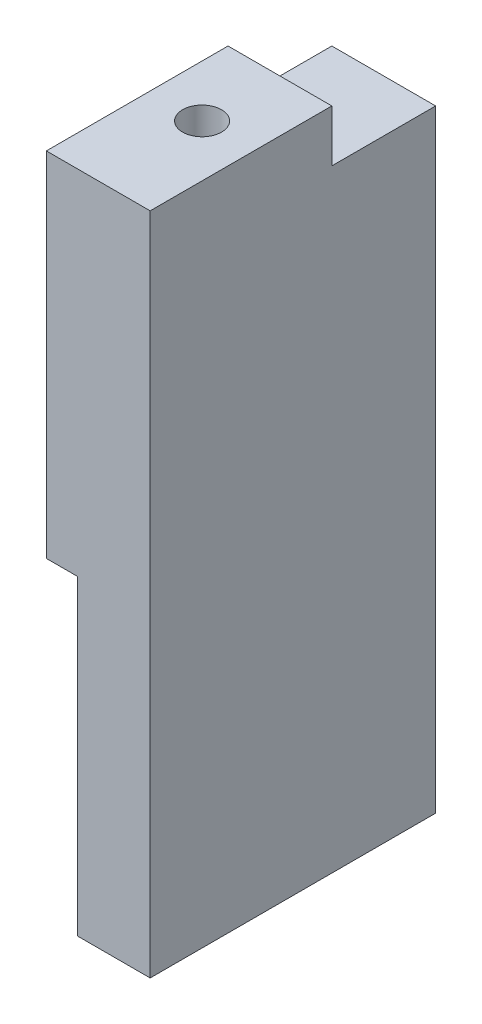
ISO-10303-21;
HEADER;
FILE_DESCRIPTION(('STEP AP214'),'2;1');
FILE_NAME('part.step','',(''),(''),'','','');
FILE_SCHEMA(('AUTOMOTIVE_DESIGN { 1 0 10303 214 1 1 1 1 }'));
ENDSEC;
DATA;
#1=APPLICATION_CONTEXT('core data for automotive mechanical design processes');
#2=APPLICATION_PROTOCOL_DEFINITION('international standard','automotive_design',2000,#1);
#3=PRODUCT_CONTEXT('',#1,'mechanical');
#4=PRODUCT('Part','Part','',(#3));
#5=PRODUCT_RELATED_PRODUCT_CATEGORY('part','',(#4));
#6=PRODUCT_DEFINITION_FORMATION('','',#4);
#7=PRODUCT_DEFINITION_CONTEXT('part definition',#1,'design');
#8=PRODUCT_DEFINITION('design','',#6,#7);
#9=PRODUCT_DEFINITION_SHAPE('','',#8);
#10=(LENGTH_UNIT() NAMED_UNIT(*) SI_UNIT(.MILLI.,.METRE.));
#11=(NAMED_UNIT(*) PLANE_ANGLE_UNIT() SI_UNIT($,.RADIAN.));
#12=(NAMED_UNIT(*) SI_UNIT($,.STERADIAN.) SOLID_ANGLE_UNIT());
#13=UNCERTAINTY_MEASURE_WITH_UNIT(LENGTH_MEASURE(1.E-05),#10,'distance_accuracy_value','');
#14=(GEOMETRIC_REPRESENTATION_CONTEXT(3) GLOBAL_UNCERTAINTY_ASSIGNED_CONTEXT((#13)) GLOBAL_UNIT_ASSIGNED_CONTEXT((#10,
#11,#12)) REPRESENTATION_CONTEXT('',''));
#15=CARTESIAN_POINT('',(0.,0.,0.));
#16=DIRECTION('',(0.,0.,1.));
#17=DIRECTION('',(1.,0.,0.));
#18=AXIS2_PLACEMENT_3D('',#15,#16,#17);
#19=CARTESIAN_POINT('',(0.,162.56,0.));
#20=DIRECTION('',(1.,0.,0.));
#21=DIRECTION('',(0.,0.,-1.));
#22=AXIS2_PLACEMENT_3D('',#19,#20,#21);
#23=PLANE('',#22);
#24=DIRECTION('',(0.,-1.,0.));
#25=VECTOR('',#24,1.);
#26=CARTESIAN_POINT('',(0.,162.56,-44.45));
#27=LINE('',#26,#25);
#28=CARTESIAN_POINT('',(0.,162.56,-44.45));
#29=VERTEX_POINT('',#28);
#30=CARTESIAN_POINT('',(0.,149.86,-44.45));
#31=VERTEX_POINT('',#30);
#32=EDGE_CURVE('E48',#29,#31,#27,.T.);
#33=ORIENTED_EDGE('',*,*,#32,.T.);
#34=DIRECTION('',(0.,0.,-1.));
#35=VECTOR('',#34,1.);
#36=CARTESIAN_POINT('',(0.,149.86,-69.85));
#37=LINE('',#36,#35);
#38=CARTESIAN_POINT('',(0.,149.86,-69.85));
#39=VERTEX_POINT('',#38);
#40=EDGE_CURVE('E125',#31,#39,#37,.T.);
#41=ORIENTED_EDGE('',*,*,#40,.T.);
#42=DIRECTION('',(0.,-1.,0.));
#43=VECTOR('',#42,1.);
#44=CARTESIAN_POINT('',(0.,162.56,-69.85));
#45=LINE('',#44,#43);
#46=CARTESIAN_POINT('',(0.,76.2,-69.85));
#47=VERTEX_POINT('',#46);
#48=EDGE_CURVE('E170',#39,#47,#45,.T.);
#49=ORIENTED_EDGE('',*,*,#48,.T.);
#50=DIRECTION('',(0.,0.,1.));
#51=VECTOR('',#50,1.);
#52=CARTESIAN_POINT('',(0.,76.2,-69.85));
#53=LINE('',#52,#51);
#54=CARTESIAN_POINT('',(0.,76.2,0.));
#55=VERTEX_POINT('',#54);
#56=EDGE_CURVE('E149',#47,#55,#53,.T.);
#57=ORIENTED_EDGE('',*,*,#56,.T.);
#58=DIRECTION('',(0.,-1.,0.));
#59=VECTOR('',#58,1.);
#60=CARTESIAN_POINT('',(0.,162.56,0.));
#61=LINE('',#60,#59);
#62=CARTESIAN_POINT('',(0.,162.56,0.));
#63=VERTEX_POINT('',#62);
#64=EDGE_CURVE('E11',#63,#55,#61,.T.);
#65=ORIENTED_EDGE('',*,*,#64,.F.);
#66=DIRECTION('',(0.,0.,1.));
#67=VECTOR('',#66,1.);
#68=CARTESIAN_POINT('',(0.,162.56,0.));
#69=LINE('',#68,#67);
#70=EDGE_CURVE('E162',#29,#63,#69,.T.);
#71=ORIENTED_EDGE('',*,*,#70,.F.);
#72=EDGE_LOOP('',(#33,#41,#49,#57,#65,#71));
#73=FACE_BOUND('',#72,.T.);
#74=ADVANCED_FACE('F34',(#73),#23,.F.);
#75=CARTESIAN_POINT('',(0.,162.56,0.));
#76=DIRECTION('',(0.,0.,-1.));
#77=DIRECTION('',(-1.,0.,0.));
#78=AXIS2_PLACEMENT_3D('',#75,#76,#77);
#79=PLANE('',#78);
#80=ORIENTED_EDGE('',*,*,#64,.T.);
#81=DIRECTION('',(-1.,0.,0.));
#82=VECTOR('',#81,1.);
#83=CARTESIAN_POINT('',(0.,76.2,0.));
#84=LINE('',#83,#82);
#85=CARTESIAN_POINT('',(7.61999999999999,76.2,0.));
#86=VERTEX_POINT('',#85);
#87=EDGE_CURVE('E142',#86,#55,#84,.T.);
#88=ORIENTED_EDGE('',*,*,#87,.F.);
#89=DIRECTION('',(0.,1.,0.));
#90=VECTOR('',#89,1.);
#91=CARTESIAN_POINT('',(7.62,0.,0.));
#92=LINE('',#91,#90);
#93=CARTESIAN_POINT('',(7.62,0.,0.));
#94=VERTEX_POINT('',#93);
#95=EDGE_CURVE('E136',#94,#86,#92,.T.);
#96=ORIENTED_EDGE('',*,*,#95,.F.);
#97=DIRECTION('',(1.,0.,0.));
#98=VECTOR('',#97,1.);
#99=CARTESIAN_POINT('',(0.,0.,0.));
#100=LINE('',#99,#98);
#101=CARTESIAN_POINT('',(25.4,0.,0.));
#102=VERTEX_POINT('',#101);
#103=EDGE_CURVE('E159',#94,#102,#100,.T.);
#104=ORIENTED_EDGE('',*,*,#103,.T.);
#105=DIRECTION('',(0.,-1.,0.));
#106=VECTOR('',#105,1.);
#107=CARTESIAN_POINT('',(25.4,162.56,0.));
#108=LINE('',#107,#106);
#109=CARTESIAN_POINT('',(25.4,162.56,0.));
#110=VERTEX_POINT('',#109);
#111=EDGE_CURVE('E41',#110,#102,#108,.T.);
#112=ORIENTED_EDGE('',*,*,#111,.F.);
#113=DIRECTION('',(1.,0.,0.));
#114=VECTOR('',#113,1.);
#115=CARTESIAN_POINT('',(0.,162.56,0.));
#116=LINE('',#115,#114);
#117=EDGE_CURVE('E164',#63,#110,#116,.T.);
#118=ORIENTED_EDGE('',*,*,#117,.F.);
#119=EDGE_LOOP('',(#80,#88,#96,#104,#112,#118));
#120=FACE_BOUND('',#119,.T.);
#121=ADVANCED_FACE('F208',(#120),#79,.F.);
#122=CARTESIAN_POINT('',(25.4,162.56,0.));
#123=DIRECTION('',(-1.,0.,0.));
#124=DIRECTION('',(0.,0.,1.));
#125=AXIS2_PLACEMENT_3D('',#122,#123,#124);
#126=PLANE('',#125);
#127=DIRECTION('',(0.,-1.,0.));
#128=VECTOR('',#127,1.);
#129=CARTESIAN_POINT('',(25.4,162.56,-69.85));
#130=LINE('',#129,#128);
#131=CARTESIAN_POINT('',(25.4,149.86,-69.85));
#132=VERTEX_POINT('',#131);
#133=CARTESIAN_POINT('',(25.4,0.,-69.85));
#134=VERTEX_POINT('',#133);
#135=EDGE_CURVE('E178',#132,#134,#130,.T.);
#136=ORIENTED_EDGE('',*,*,#135,.F.);
#137=DIRECTION('',(0.,0.,-1.));
#138=VECTOR('',#137,1.);
#139=CARTESIAN_POINT('',(25.4,149.86,-69.85));
#140=LINE('',#139,#138);
#141=CARTESIAN_POINT('',(25.4,149.86,-44.45));
#142=VERTEX_POINT('',#141);
#143=EDGE_CURVE('E126',#142,#132,#140,.T.);
#144=ORIENTED_EDGE('',*,*,#143,.F.);
#145=DIRECTION('',(0.,-1.,0.));
#146=VECTOR('',#145,1.);
#147=CARTESIAN_POINT('',(25.4,162.56,-44.45));
#148=LINE('',#147,#146);
#149=CARTESIAN_POINT('',(25.4,162.56,-44.45));
#150=VERTEX_POINT('',#149);
#151=EDGE_CURVE('E123',#150,#142,#148,.T.);
#152=ORIENTED_EDGE('',*,*,#151,.F.);
#153=DIRECTION('',(0.,0.,-1.));
#154=VECTOR('',#153,1.);
#155=CARTESIAN_POINT('',(25.4,162.56,0.));
#156=LINE('',#155,#154);
#157=EDGE_CURVE('E167',#110,#150,#156,.T.);
#158=ORIENTED_EDGE('',*,*,#157,.F.);
#159=ORIENTED_EDGE('',*,*,#111,.T.);
#160=DIRECTION('',(0.,0.,-1.));
#161=VECTOR('',#160,1.);
#162=CARTESIAN_POINT('',(25.4,0.,0.));
#163=LINE('',#162,#161);
#164=EDGE_CURVE('E172',#102,#134,#163,.T.);
#165=ORIENTED_EDGE('',*,*,#164,.T.);
#166=EDGE_LOOP('',(#136,#144,#152,#158,#159,#165));
#167=FACE_BOUND('',#166,.T.);
#168=ADVANCED_FACE('F185',(#167),#126,.F.);
#169=CARTESIAN_POINT('',(0.,162.56,-69.85));
#170=DIRECTION('',(0.,0.,1.));
#171=DIRECTION('',(1.,0.,0.));
#172=AXIS2_PLACEMENT_3D('',#169,#170,#171);
#173=PLANE('',#172);
#174=CARTESIAN_POINT('',(17.78,43.18,-69.85));
#175=DIRECTION('',(0.,0.,-1.));
#176=DIRECTION('',(-1.,0.,0.));
#177=AXIS2_PLACEMENT_3D('',#174,#175,#176);
#178=CIRCLE('',#177,2.55269999999999);
#179=CARTESIAN_POINT('',(15.2273,43.18,-69.85));
#180=VERTEX_POINT('',#179);
#181=EDGE_CURVE('E113',#180,#180,#178,.T.);
#182=ORIENTED_EDGE('',*,*,#181,.F.);
#183=EDGE_LOOP('',(#182));
#184=FACE_BOUND('',#183,.T.);
#185=CARTESIAN_POINT('',(17.78,12.7,-69.85));
#186=DIRECTION('',(0.,0.,-1.));
#187=DIRECTION('',(-1.,0.,0.));
#188=AXIS2_PLACEMENT_3D('',#185,#186,#187);
#189=CIRCLE('',#188,2.55269999999999);
#190=CARTESIAN_POINT('',(15.2273,12.7,-69.85));
#191=VERTEX_POINT('',#190);
#192=EDGE_CURVE('E112',#191,#191,#189,.T.);
#193=ORIENTED_EDGE('',*,*,#192,.F.);
#194=EDGE_LOOP('',(#193));
#195=FACE_BOUND('',#194,.T.);
#196=ORIENTED_EDGE('',*,*,#48,.F.);
#197=DIRECTION('',(1.,0.,0.));
#198=VECTOR('',#197,1.);
#199=CARTESIAN_POINT('',(0.,149.86,-69.85));
#200=LINE('',#199,#198);
#201=EDGE_CURVE('E133',#39,#132,#200,.T.);
#202=ORIENTED_EDGE('',*,*,#201,.T.);
#203=ORIENTED_EDGE('',*,*,#135,.T.);
#204=DIRECTION('',(-1.,0.,0.));
#205=VECTOR('',#204,1.);
#206=CARTESIAN_POINT('',(0.,0.,-69.85));
#207=LINE('',#206,#205);
#208=CARTESIAN_POINT('',(7.62,0.,-69.85));
#209=VERTEX_POINT('',#208);
#210=EDGE_CURVE('E165',#134,#209,#207,.T.);
#211=ORIENTED_EDGE('',*,*,#210,.T.);
#212=DIRECTION('',(0.,1.,0.));
#213=VECTOR('',#212,1.);
#214=CARTESIAN_POINT('',(7.62,0.,-69.85));
#215=LINE('',#214,#213);
#216=CARTESIAN_POINT('',(7.61999999999999,76.2,-69.85));
#217=VERTEX_POINT('',#216);
#218=EDGE_CURVE('E56',#209,#217,#215,.T.);
#219=ORIENTED_EDGE('',*,*,#218,.T.);
#220=DIRECTION('',(-1.,0.,0.));
#221=VECTOR('',#220,1.);
#222=CARTESIAN_POINT('',(0.,76.2,-69.85));
#223=LINE('',#222,#221);
#224=EDGE_CURVE('E141',#217,#47,#223,.T.);
#225=ORIENTED_EDGE('',*,*,#224,.T.);
#226=EDGE_LOOP('',(#196,#202,#203,#211,#219,#225));
#227=FACE_BOUND('',#226,.T.);
#228=ADVANCED_FACE('F195',(#184,#195,#227),#173,.F.);
#229=CARTESIAN_POINT('',(0.,162.56,0.));
#230=DIRECTION('',(0.,-1.,0.));
#231=DIRECTION('',(0.,0.,-1.));
#232=AXIS2_PLACEMENT_3D('',#229,#230,#231);
#233=PLANE('',#232);
#234=CARTESIAN_POINT('',(12.7,162.56,-25.4));
#235=DIRECTION('',(0.,1.,0.));
#236=DIRECTION('',(0.,0.,1.));
#237=AXIS2_PLACEMENT_3D('',#234,#235,#236);
#238=CIRCLE('',#237,4.7625);
#239=CARTESIAN_POINT('',(12.7,162.56,-20.6375));
#240=VERTEX_POINT('',#239);
#241=EDGE_CURVE('E152',#240,#240,#238,.T.);
#242=ORIENTED_EDGE('',*,*,#241,.F.);
#243=EDGE_LOOP('',(#242));
#244=FACE_BOUND('',#243,.T.);
#245=ORIENTED_EDGE('',*,*,#157,.T.);
#246=DIRECTION('',(1.,0.,0.));
#247=VECTOR('',#246,1.);
#248=CARTESIAN_POINT('',(0.,162.56,-44.45));
#249=LINE('',#248,#247);
#250=EDGE_CURVE('E129',#29,#150,#249,.T.);
#251=ORIENTED_EDGE('',*,*,#250,.F.);
#252=ORIENTED_EDGE('',*,*,#70,.T.);
#253=ORIENTED_EDGE('',*,*,#117,.T.);
#254=EDGE_LOOP('',(#245,#251,#252,#253));
#255=FACE_BOUND('',#254,.T.);
#256=ADVANCED_FACE('F203',(#244,#255),#233,.F.);
#257=CARTESIAN_POINT('',(0.,0.,0.));
#258=DIRECTION('',(0.,-1.,0.));
#259=DIRECTION('',(0.,0.,-1.));
#260=AXIS2_PLACEMENT_3D('',#257,#258,#259);
#261=PLANE('',#260);
#262=DIRECTION('',(0.,0.,1.));
#263=VECTOR('',#262,1.);
#264=CARTESIAN_POINT('',(7.62,0.,-69.85));
#265=LINE('',#264,#263);
#266=EDGE_CURVE('E145',#209,#94,#265,.T.);
#267=ORIENTED_EDGE('',*,*,#266,.F.);
#268=ORIENTED_EDGE('',*,*,#210,.F.);
#269=ORIENTED_EDGE('',*,*,#164,.F.);
#270=ORIENTED_EDGE('',*,*,#103,.F.);
#271=EDGE_LOOP('',(#267,#268,#269,#270));
#272=FACE_BOUND('',#271,.T.);
#273=ADVANCED_FACE('F192',(#272),#261,.T.);
#274=CARTESIAN_POINT('',(12.7,111.76,-25.4));
#275=DIRECTION('',(0.,1.,0.));
#276=DIRECTION('',(0.,0.,1.));
#277=AXIS2_PLACEMENT_3D('',#274,#275,#276);
#278=CYLINDRICAL_SURFACE('',#277,4.7625);
#279=CARTESIAN_POINT('',(12.7,111.76,-25.4));
#280=DIRECTION('',(0.,1.,0.));
#281=DIRECTION('',(0.,0.,1.));
#282=AXIS2_PLACEMENT_3D('',#279,#280,#281);
#283=CIRCLE('',#282,4.7625);
#284=CARTESIAN_POINT('',(12.7,111.76,-20.6375));
#285=VERTEX_POINT('',#284);
#286=EDGE_CURVE('E156',#285,#285,#283,.T.);
#287=ORIENTED_EDGE('',*,*,#286,.F.);
#288=EDGE_LOOP('',(#287));
#289=FACE_BOUND('',#288,.T.);
#290=ORIENTED_EDGE('',*,*,#241,.T.);
#291=EDGE_LOOP('',(#290));
#292=FACE_BOUND('',#291,.T.);
#293=ADVANCED_FACE('F238',(#289,#292),#278,.F.);
#294=CARTESIAN_POINT('',(12.7,111.76,-25.4));
#295=DIRECTION('',(0.,1.,0.));
#296=DIRECTION('',(0.,0.,1.));
#297=AXIS2_PLACEMENT_3D('',#294,#295,#296);
#298=PLANE('',#297);
#299=ORIENTED_EDGE('',*,*,#286,.T.);
#300=EDGE_LOOP('',(#299));
#301=FACE_BOUND('',#300,.T.);
#302=ADVANCED_FACE('F221',(#301),#298,.T.);
#303=CARTESIAN_POINT('',(0.,76.2,-69.85));
#304=DIRECTION('',(0.,1.,0.));
#305=DIRECTION('',(0.,0.,1.));
#306=AXIS2_PLACEMENT_3D('',#303,#304,#305);
#307=PLANE('',#306);
#308=ORIENTED_EDGE('',*,*,#87,.T.);
#309=ORIENTED_EDGE('',*,*,#56,.F.);
#310=ORIENTED_EDGE('',*,*,#224,.F.);
#311=DIRECTION('',(0.,0.,1.));
#312=VECTOR('',#311,1.);
#313=CARTESIAN_POINT('',(7.61999999999999,76.2,-69.85));
#314=LINE('',#313,#312);
#315=EDGE_CURVE('E153',#217,#86,#314,.T.);
#316=ORIENTED_EDGE('',*,*,#315,.T.);
#317=EDGE_LOOP('',(#308,#309,#310,#316));
#318=FACE_BOUND('',#317,.T.);
#319=ADVANCED_FACE('F211',(#318),#307,.F.);
#320=CARTESIAN_POINT('',(7.62,0.,-69.85));
#321=DIRECTION('',(1.,0.,0.));
#322=DIRECTION('',(0.,1.,0.));
#323=AXIS2_PLACEMENT_3D('',#320,#321,#322);
#324=PLANE('',#323);
#325=ORIENTED_EDGE('',*,*,#95,.T.);
#326=ORIENTED_EDGE('',*,*,#315,.F.);
#327=ORIENTED_EDGE('',*,*,#218,.F.);
#328=ORIENTED_EDGE('',*,*,#266,.T.);
#329=EDGE_LOOP('',(#325,#326,#327,#328));
#330=FACE_BOUND('',#329,.T.);
#331=ADVANCED_FACE('F213',(#330),#324,.F.);
#332=CARTESIAN_POINT('',(0.,149.86,-69.85));
#333=DIRECTION('',(0.,-1.,0.));
#334=DIRECTION('',(0.,0.,-1.));
#335=AXIS2_PLACEMENT_3D('',#332,#333,#334);
#336=PLANE('',#335);
#337=ORIENTED_EDGE('',*,*,#143,.T.);
#338=ORIENTED_EDGE('',*,*,#201,.F.);
#339=ORIENTED_EDGE('',*,*,#40,.F.);
#340=DIRECTION('',(1.,0.,0.));
#341=VECTOR('',#340,1.);
#342=CARTESIAN_POINT('',(0.,149.86,-44.45));
#343=LINE('',#342,#341);
#344=EDGE_CURVE('E137',#31,#142,#343,.T.);
#345=ORIENTED_EDGE('',*,*,#344,.T.);
#346=EDGE_LOOP('',(#337,#338,#339,#345));
#347=FACE_BOUND('',#346,.T.);
#348=ADVANCED_FACE('F198',(#347),#336,.F.);
#349=CARTESIAN_POINT('',(0.,162.56,-44.45));
#350=DIRECTION('',(0.,0.,1.));
#351=DIRECTION('',(0.,-1.,0.));
#352=AXIS2_PLACEMENT_3D('',#349,#350,#351);
#353=PLANE('',#352);
#354=ORIENTED_EDGE('',*,*,#151,.T.);
#355=ORIENTED_EDGE('',*,*,#344,.F.);
#356=ORIENTED_EDGE('',*,*,#32,.F.);
#357=ORIENTED_EDGE('',*,*,#250,.T.);
#358=EDGE_LOOP('',(#354,#355,#356,#357));
#359=FACE_BOUND('',#358,.T.);
#360=ADVANCED_FACE('F200',(#359),#353,.F.);
#361=CARTESIAN_POINT('',(17.78,12.7,-46.99));
#362=DIRECTION('',(0.,0.,-1.));
#363=DIRECTION('',(-1.,0.,0.));
#364=AXIS2_PLACEMENT_3D('',#361,#362,#363);
#365=CONICAL_SURFACE('',#364,2.55269999999999,1.02974425867665);
#366=CARTESIAN_POINT('',(17.78,12.7,-45.4561830978083));
#367=VERTEX_POINT('',#366);
#368=VERTEX_LOOP('',#367);
#369=FACE_BOUND('',#368,.T.);
#370=CARTESIAN_POINT('',(17.78,12.7,-46.99));
#371=DIRECTION('',(0.,0.,-1.));
#372=DIRECTION('',(-1.,0.,0.));
#373=AXIS2_PLACEMENT_3D('',#370,#371,#372);
#374=CIRCLE('',#373,2.55269999999999);
#375=CARTESIAN_POINT('',(15.2273,12.7,-46.99));
#376=VERTEX_POINT('',#375);
#377=EDGE_CURVE('E116',#376,#376,#374,.T.);
#378=ORIENTED_EDGE('',*,*,#377,.T.);
#379=EDGE_LOOP('',(#378));
#380=FACE_BOUND('',#379,.T.);
#381=ADVANCED_FACE('F297',(#369,#380),#365,.F.);
#382=CARTESIAN_POINT('',(17.78,12.7,-69.85));
#383=DIRECTION('',(0.,0.,-1.));
#384=DIRECTION('',(-1.,0.,0.));
#385=AXIS2_PLACEMENT_3D('',#382,#383,#384);
#386=CYLINDRICAL_SURFACE('',#385,2.55269999999999);
#387=ORIENTED_EDGE('',*,*,#377,.F.);
#388=EDGE_LOOP('',(#387));
#389=FACE_BOUND('',#388,.T.);
#390=ORIENTED_EDGE('',*,*,#192,.T.);
#391=EDGE_LOOP('',(#390));
#392=FACE_BOUND('',#391,.T.);
#393=ADVANCED_FACE('F106',(#389,#392),#386,.F.);
#394=CARTESIAN_POINT('',(17.78,43.18,-46.99));
#395=DIRECTION('',(0.,0.,-1.));
#396=DIRECTION('',(-1.,0.,0.));
#397=AXIS2_PLACEMENT_3D('',#394,#395,#396);
#398=CONICAL_SURFACE('',#397,2.55269999999999,1.02974425867665);
#399=CARTESIAN_POINT('',(17.78,43.18,-45.4561830978083));
#400=VERTEX_POINT('',#399);
#401=VERTEX_LOOP('',#400);
#402=FACE_BOUND('',#401,.T.);
#403=CARTESIAN_POINT('',(17.78,43.18,-46.99));
#404=DIRECTION('',(0.,0.,-1.));
#405=DIRECTION('',(-1.,0.,0.));
#406=AXIS2_PLACEMENT_3D('',#403,#404,#405);
#407=CIRCLE('',#406,2.55269999999999);
#408=CARTESIAN_POINT('',(15.2273,43.18,-46.99));
#409=VERTEX_POINT('',#408);
#410=EDGE_CURVE('E110',#409,#409,#407,.T.);
#411=ORIENTED_EDGE('',*,*,#410,.T.);
#412=EDGE_LOOP('',(#411));
#413=FACE_BOUND('',#412,.T.);
#414=ADVANCED_FACE('F102',(#402,#413),#398,.F.);
#415=CARTESIAN_POINT('',(17.78,43.18,-69.85));
#416=DIRECTION('',(0.,0.,-1.));
#417=DIRECTION('',(-1.,0.,0.));
#418=AXIS2_PLACEMENT_3D('',#415,#416,#417);
#419=CYLINDRICAL_SURFACE('',#418,2.55269999999999);
#420=ORIENTED_EDGE('',*,*,#410,.F.);
#421=EDGE_LOOP('',(#420));
#422=FACE_BOUND('',#421,.T.);
#423=ORIENTED_EDGE('',*,*,#181,.T.);
#424=EDGE_LOOP('',(#423));
#425=FACE_BOUND('',#424,.T.);
#426=ADVANCED_FACE('F105',(#422,#425),#419,.F.);
#427=CLOSED_SHELL('',(#74,#121,#168,#228,#256,#273,#293,#302,#319,#331,#348,#360,#381,#393,#414,#426));
#428=MANIFOLD_SOLID_BREP('B2',#427);
#429=ADVANCED_BREP_SHAPE_REPRESENTATION('',(#18,#428),#14);
#430=SHAPE_DEFINITION_REPRESENTATION(#9,#429);
ENDSEC;
END-ISO-10303-21;
